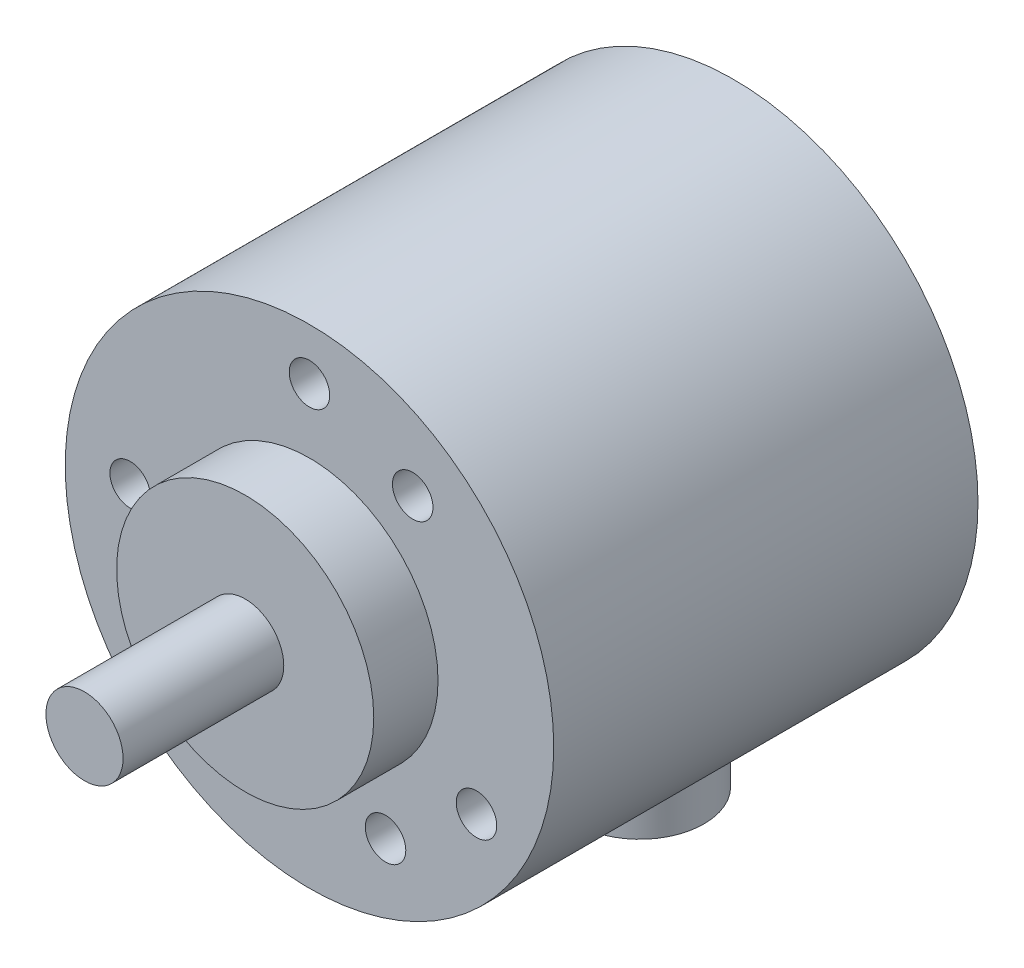
ISO-10303-21;
HEADER;
FILE_DESCRIPTION(('STEP AP214'),'2;1');
FILE_NAME('part.step','',(''),(''),'','','');
FILE_SCHEMA(('AUTOMOTIVE_DESIGN { 1 0 10303 214 1 1 1 1 }'));
ENDSEC;
DATA;
#1=APPLICATION_CONTEXT('core data for automotive mechanical design processes');
#2=APPLICATION_PROTOCOL_DEFINITION('international standard','automotive_design',2000,#1);
#3=PRODUCT_CONTEXT('',#1,'mechanical');
#4=PRODUCT('Part','Part','',(#3));
#5=PRODUCT_RELATED_PRODUCT_CATEGORY('part','',(#4));
#6=PRODUCT_DEFINITION_FORMATION('','',#4);
#7=PRODUCT_DEFINITION_CONTEXT('part definition',#1,'design');
#8=PRODUCT_DEFINITION('design','',#6,#7);
#9=PRODUCT_DEFINITION_SHAPE('','',#8);
#10=(LENGTH_UNIT() NAMED_UNIT(*) SI_UNIT(.MILLI.,.METRE.));
#11=(NAMED_UNIT(*) PLANE_ANGLE_UNIT() SI_UNIT($,.RADIAN.));
#12=(NAMED_UNIT(*) SI_UNIT($,.STERADIAN.) SOLID_ANGLE_UNIT());
#13=UNCERTAINTY_MEASURE_WITH_UNIT(LENGTH_MEASURE(1.E-05),#10,'distance_accuracy_value','');
#14=(GEOMETRIC_REPRESENTATION_CONTEXT(3) GLOBAL_UNCERTAINTY_ASSIGNED_CONTEXT((#13)) GLOBAL_UNIT_ASSIGNED_CONTEXT((#10,
#11,#12)) REPRESENTATION_CONTEXT('',''));
#15=CARTESIAN_POINT('',(0.,0.,0.));
#16=DIRECTION('',(0.,0.,1.));
#17=DIRECTION('',(1.,0.,0.));
#18=AXIS2_PLACEMENT_3D('',#15,#16,#17);
#19=CARTESIAN_POINT('',(0.,0.,-33.));
#20=DIRECTION('',(0.,0.,1.));
#21=DIRECTION('',(1.,0.,0.));
#22=AXIS2_PLACEMENT_3D('',#19,#20,#21);
#23=CYLINDRICAL_SURFACE('',#22,19.);
#24=CARTESIAN_POINT('',(0.,-19.,-20.6885576271931));
#25=CARTESIAN_POINT('',(-0.275769326400333,-18.9999957178638,-20.6885644438757));
#26=CARTESIAN_POINT('',(-0.551612339964107,-18.9939369110743,-20.7114487901662));
#27=CARTESIAN_POINT('',(-1.09536084420814,-18.9703552522905,-20.8022249046444));
#28=CARTESIAN_POINT('',(-1.36326229934773,-18.9528266728315,-20.8701391588736));
#29=CARTESIAN_POINT('',(-1.88319959043665,-18.9082415265209,-21.0486207779896));
#30=CARTESIAN_POINT('',(-2.13525511097029,-18.8811970679014,-21.1591339559744));
#31=CARTESIAN_POINT('',(-2.61725305763118,-18.8204430306565,-21.4194776693207));
#32=CARTESIAN_POINT('',(-2.84719416312159,-18.7867330543442,-21.5693105508009));
#33=CARTESIAN_POINT('',(-3.28363987258849,-18.7154388327318,-21.9076208585884));
#34=CARTESIAN_POINT('',(-3.48957269264305,-18.6777897345587,-22.0968222823242));
#35=CARTESIAN_POINT('',(-3.86718169173115,-18.6032800591516,-22.5069507445252));
#36=CARTESIAN_POINT('',(-4.03885358169212,-18.5664195811586,-22.7278817492216));
#37=CARTESIAN_POINT('',(-4.34583417024358,-18.4969993222001,-23.199735163946));
#38=CARTESIAN_POINT('',(-4.48048899736331,-18.4645214758363,-23.4510961317811));
#39=CARTESIAN_POINT('',(-4.7054029505289,-18.4084956128093,-23.9738818356396));
#40=CARTESIAN_POINT('',(-4.79567002552072,-18.3849459974541,-24.2453029692724));
#41=CARTESIAN_POINT('',(-4.92726790269511,-18.3501118941767,-24.7941814834072));
#42=CARTESIAN_POINT('',(-4.96963355234476,-18.3385684873096,-25.0713739228889));
#43=CARTESIAN_POINT('',(-5.00745164847048,-18.328279903082,-25.6291536385349));
#44=CARTESIAN_POINT('',(-5.00291261345676,-18.3295324018157,-25.9097402890204));
#45=CARTESIAN_POINT('',(-4.9478726318895,-18.3444621543897,-26.4582980861095));
#46=CARTESIAN_POINT('',(-4.89861973809088,-18.3578020069334,-26.7264050947366));
#47=CARTESIAN_POINT('',(-4.75754734011486,-18.3948637106681,-27.2504096346106));
#48=CARTESIAN_POINT('',(-4.66572451326531,-18.4185863722508,-27.5063062110879));
#49=CARTESIAN_POINT('',(-4.4410917967273,-18.4740402179201,-28.0018992013427));
#50=CARTESIAN_POINT('',(-4.30784106339798,-18.5058568359772,-28.2413858353188));
#51=CARTESIAN_POINT('',(-4.00444274039802,-18.573867245553,-28.6950403454886));
#52=CARTESIAN_POINT('',(-3.83428805975344,-18.6100618777007,-28.9092033435905));
#53=CARTESIAN_POINT('',(-3.45551254292273,-18.6841580271555,-29.3132666121022));
#54=CARTESIAN_POINT('',(-3.24584253203104,-18.7220772644082,-29.5021814711523));
#55=CARTESIAN_POINT('',(-2.79733618090121,-18.794319031737,-29.8423669359891));
#56=CARTESIAN_POINT('',(-2.55849875038486,-18.828641427274,-29.9936361339384));
#57=CARTESIAN_POINT('',(-2.05693717567475,-18.8900243975419,-30.2546544871163));
#58=CARTESIAN_POINT('',(-1.79411828743571,-18.9170543384444,-30.364229260866));
#59=CARTESIAN_POINT('',(-1.25291705070341,-18.9605851829004,-30.5373584547851));
#60=CARTESIAN_POINT('',(-0.974538024889809,-18.9770883250536,-30.600922659821));
#61=CARTESIAN_POINT('',(-0.418531665055095,-18.9973691359723,-30.6786882684621));
#62=CARTESIAN_POINT('',(-0.141104095967862,-19.0014922111205,-30.6942298811987));
#63=CARTESIAN_POINT('',(0.412392174634826,-18.9975393920985,-30.6792048349418));
#64=CARTESIAN_POINT('',(0.688461009865304,-18.9894647234237,-30.648642807936));
#65=CARTESIAN_POINT('',(1.22664703082866,-18.9622464275131,-30.5433785359608));
#66=CARTESIAN_POINT('',(1.48892004105413,-18.9432894848034,-30.4694202871233));
#67=CARTESIAN_POINT('',(1.99731390900085,-18.8964538133382,-30.2803238861059));
#68=CARTESIAN_POINT('',(2.24343303697948,-18.8685741310162,-30.1651813324353));
#69=CARTESIAN_POINT('',(2.71776721238243,-18.8061722513547,-29.8944749829268));
#70=CARTESIAN_POINT('',(2.94554769813589,-18.7715327802268,-29.738177448049));
#71=CARTESIAN_POINT('',(3.37211945160329,-18.6996172131604,-29.3905235664122));
#72=CARTESIAN_POINT('',(3.57090513544079,-18.6623406114053,-29.1991604826284));
#73=CARTESIAN_POINT('',(3.93946537763554,-18.5880870950829,-28.7805596057893));
#74=CARTESIAN_POINT('',(4.10829545608396,-18.5511463973769,-28.5524823005092));
#75=CARTESIAN_POINT('',(4.40530154568804,-18.4828739909468,-28.0704566349354));
#76=CARTESIAN_POINT('',(4.5334792853183,-18.451542043772,-27.8165093751988));
#77=CARTESIAN_POINT('',(4.74457728048383,-18.3983923637822,-27.2912451580635));
#78=CARTESIAN_POINT('',(4.82776168851186,-18.3765192543105,-27.0200402648783));
#79=CARTESIAN_POINT('',(4.94715371079317,-18.3447420107922,-26.4668211727028));
#80=CARTESIAN_POINT('',(4.98337294925862,-18.3348349151139,-26.1848096662236));
#81=CARTESIAN_POINT('',(5.00715081173977,-18.3283542048942,-25.6276392717423));
#82=CARTESIAN_POINT('',(4.99622557405378,-18.3313651360785,-25.3525489364774));
#83=CARTESIAN_POINT('',(4.92953140114559,-18.3494111434725,-24.8082816187589));
#84=CARTESIAN_POINT('',(4.87376356323929,-18.3644459254538,-24.5391044917723));
#85=CARTESIAN_POINT('',(4.71983552306685,-18.404601627765,-24.0161567242314));
#86=CARTESIAN_POINT('',(4.6219886449165,-18.4296479062774,-23.7622877250283));
#87=CARTESIAN_POINT('',(4.38692411825137,-18.487008102539,-23.2743792997176));
#88=CARTESIAN_POINT('',(4.24970044321719,-18.5193231325885,-23.0403429160491));
#89=CARTESIAN_POINT('',(3.93514861806089,-18.5887388284062,-22.5914868020298));
#90=CARTESIAN_POINT('',(3.75678207589861,-18.6259502628499,-22.377411792047));
#91=CARTESIAN_POINT('',(3.36699304774797,-18.7003384349729,-21.9817388004712));
#92=CARTESIAN_POINT('',(3.15556257964815,-18.7375151620875,-21.8001486839575));
#93=CARTESIAN_POINT('',(2.70037417260271,-18.8085635163672,-21.4709171344818));
#94=CARTESIAN_POINT('',(2.45603841361695,-18.8423509547618,-21.3240549077127));
#95=CARTESIAN_POINT('',(1.94526775833223,-18.9019003201304,-21.0737227260058));
#96=CARTESIAN_POINT('',(1.67884754204237,-18.9276675250045,-20.9702242189807));
#97=CARTESIAN_POINT('',(1.1777515930537,-18.9648374183622,-20.8234614468889));
#98=CARTESIAN_POINT('',(0.945286703979938,-18.9779285000888,-20.7729882261237));
#99=CARTESIAN_POINT('',(0.475232463380953,-18.9955112347954,-20.7055349416406));
#100=CARTESIAN_POINT('',(0.237643592071627,-19.0000036901211,-20.6885517529324));
#101=CARTESIAN_POINT('',(0.,-19.,-20.6885576271931));
#102=B_SPLINE_CURVE_WITH_KNOTS('',3,(#24,#25,#26,#27,#28,#29,#30,#31,#32,#33,#34,#35,#36,#37,
#38,#39,#40,#41,#42,#43,#44,#45,#46,#47,#48,#49,#50,#51,#52,#53,#54,#55,#56,#57,#58,#59,#60,#61,
#62,#63,#64,#65,#66,#67,#68,#69,#70,#71,#72,#73,#74,#75,#76,#77,#78,#79,#80,#81,#82,#83,#84,#85,
#86,#87,#88,#89,#90,#91,#92,#93,#94,#95,#96,#97,#98,#99,#100,#101),.UNSPECIFIED.,.T.,.F.,(4,2,2,
2,2,2,2,2,2,2,2,2,2,2,2,2,2,2,2,2,2,2,2,2,2,2,2,2,2,2,2,2,2,2,2,2,2,2,4),(0.,0.826436614585058,
1.65328622796854,2.47908752031453,3.30493809758612,4.14758534874994,4.99033802353204,
5.84713921235247,6.70378690953223,7.54155141820608,8.37916378045474,9.19409222959364,
10.0090842963108,10.8330642107706,11.6572025907903,12.5074895148544,13.35780823238,
14.2116451980492,15.0653005285529,15.8949065177972,16.7244291628853,17.5401294360794,
18.3559169116766,19.187369712665,20.0189824256652,20.873388302508,21.7277578464623,
22.577055451357,23.4261428089294,24.2481310576987,25.0700991927074,25.8860500675688,
26.702125888318,27.5416338064332,28.3813447077047,29.2384104629446,30.0949110079133,
30.8071573512508,31.5193372309826),.UNSPECIFIED.);
#103=CARTESIAN_POINT('',(0.,-19.,-20.6885576271931));
#104=VERTEX_POINT('',#103);
#105=EDGE_CURVE('E10',#104,#104,#102,.T.);
#106=ORIENTED_EDGE('',*,*,#105,.F.);
#107=EDGE_LOOP('',(#106));
#108=FACE_BOUND('',#107,.T.);
#109=CARTESIAN_POINT('',(0.,0.,-33.));
#110=DIRECTION('',(0.,0.,1.));
#111=DIRECTION('',(1.,0.,0.));
#112=AXIS2_PLACEMENT_3D('',#109,#110,#111);
#113=CIRCLE('',#112,19.);
#114=CARTESIAN_POINT('',(19.,0.,-33.));
#115=VERTEX_POINT('',#114);
#116=EDGE_CURVE('E50',#115,#115,#113,.T.);
#117=ORIENTED_EDGE('',*,*,#116,.T.);
#118=EDGE_LOOP('',(#117));
#119=FACE_BOUND('',#118,.T.);
#120=CARTESIAN_POINT('',(0.,0.,0.));
#121=DIRECTION('',(0.,0.,1.));
#122=DIRECTION('',(1.,0.,0.));
#123=AXIS2_PLACEMENT_3D('',#120,#121,#122);
#124=CIRCLE('',#123,19.);
#125=CARTESIAN_POINT('',(19.,0.,0.));
#126=VERTEX_POINT('',#125);
#127=EDGE_CURVE('E57',#126,#126,#124,.T.);
#128=ORIENTED_EDGE('',*,*,#127,.F.);
#129=EDGE_LOOP('',(#128));
#130=FACE_BOUND('',#129,.T.);
#131=ADVANCED_FACE('F38',(#108,#119,#130),#23,.T.);
#132=CARTESIAN_POINT('',(0.,0.,-33.));
#133=DIRECTION('',(0.,0.,1.));
#134=DIRECTION('',(1.,0.,0.));
#135=AXIS2_PLACEMENT_3D('',#132,#133,#134);
#136=PLANE('',#135);
#137=ORIENTED_EDGE('',*,*,#116,.F.);
#138=EDGE_LOOP('',(#137));
#139=FACE_BOUND('',#138,.T.);
#140=ADVANCED_FACE('F144',(#139),#136,.F.);
#141=CARTESIAN_POINT('',(0.,0.,0.));
#142=DIRECTION('',(0.,0.,1.));
#143=DIRECTION('',(1.,0.,0.));
#144=AXIS2_PLACEMENT_3D('',#141,#142,#143);
#145=PLANE('',#144);
#146=CARTESIAN_POINT('',(0.,15.,0.));
#147=DIRECTION('',(0.,0.,1.));
#148=DIRECTION('',(1.,0.,0.));
#149=AXIS2_PLACEMENT_3D('',#146,#147,#148);
#150=CIRCLE('',#149,1.575);
#151=CARTESIAN_POINT('',(1.575,15.,0.));
#152=VERTEX_POINT('',#151);
#153=EDGE_CURVE('E101',#152,#152,#150,.T.);
#154=ORIENTED_EDGE('',*,*,#153,.F.);
#155=EDGE_LOOP('',(#154));
#156=FACE_BOUND('',#155,.T.);
#157=CARTESIAN_POINT('',(-13.946725773284,1.22018039846628,0.));
#158=DIRECTION('',(0.,0.,1.));
#159=DIRECTION('',(1.,0.,0.));
#160=AXIS2_PLACEMENT_3D('',#157,#158,#159);
#161=CIRCLE('',#160,1.57500000000105);
#162=CARTESIAN_POINT('',(-12.3717257732829,1.22018039846628,0.));
#163=VERTEX_POINT('',#162);
#164=EDGE_CURVE('E107',#163,#163,#161,.T.);
#165=ORIENTED_EDGE('',*,*,#164,.F.);
#166=EDGE_LOOP('',(#165));
#167=FACE_BOUND('',#166,.T.);
#168=CARTESIAN_POINT('',(12.9903810567675,-7.49999999999945,0.));
#169=DIRECTION('',(0.,0.,1.));
#170=DIRECTION('',(1.,0.,0.));
#171=AXIS2_PLACEMENT_3D('',#168,#169,#170);
#172=CIRCLE('',#171,1.575);
#173=CARTESIAN_POINT('',(14.5653810567675,-7.49999999999945,0.));
#174=VERTEX_POINT('',#173);
#175=EDGE_CURVE('E98',#174,#174,#172,.T.);
#176=ORIENTED_EDGE('',*,*,#175,.F.);
#177=EDGE_LOOP('',(#176));
#178=FACE_BOUND('',#177,.T.);
#179=CARTESIAN_POINT('',(-12.9903810567656,-7.50000000000056,0.));
#180=DIRECTION('',(0.,0.,1.));
#181=DIRECTION('',(1.,0.,0.));
#182=AXIS2_PLACEMENT_3D('',#179,#180,#181);
#183=CIRCLE('',#182,1.575);
#184=CARTESIAN_POINT('',(-11.4153810567656,-7.50000000000056,0.));
#185=VERTEX_POINT('',#184);
#186=EDGE_CURVE('E89',#185,#185,#183,.T.);
#187=ORIENTED_EDGE('',*,*,#186,.F.);
#188=EDGE_LOOP('',(#187));
#189=FACE_BOUND('',#188,.T.);
#190=CARTESIAN_POINT('',(8.03007010891466,11.4681286200459,0.));
#191=DIRECTION('',(0.,0.,1.));
#192=DIRECTION('',(1.,0.,0.));
#193=AXIS2_PLACEMENT_3D('',#190,#191,#192);
#194=CIRCLE('',#193,1.575);
#195=CARTESIAN_POINT('',(9.60507010891466,11.4681286200459,0.));
#196=VERTEX_POINT('',#195);
#197=EDGE_CURVE('E90',#196,#196,#194,.T.);
#198=ORIENTED_EDGE('',*,*,#197,.F.);
#199=EDGE_LOOP('',(#198));
#200=FACE_BOUND('',#199,.T.);
#201=CARTESIAN_POINT('',(5.91665566437082,-12.6883090185132,0.));
#202=DIRECTION('',(0.,0.,1.));
#203=DIRECTION('',(1.,0.,0.));
#204=AXIS2_PLACEMENT_3D('',#201,#202,#203);
#205=CIRCLE('',#204,1.57500000000018);
#206=CARTESIAN_POINT('',(7.491655664371,-12.6883090185132,0.));
#207=VERTEX_POINT('',#206);
#208=EDGE_CURVE('E106',#207,#207,#205,.T.);
#209=ORIENTED_EDGE('',*,*,#208,.F.);
#210=EDGE_LOOP('',(#209));
#211=FACE_BOUND('',#210,.T.);
#212=CARTESIAN_POINT('',(0.,0.,0.));
#213=DIRECTION('',(0.,0.,1.));
#214=DIRECTION('',(1.,0.,0.));
#215=AXIS2_PLACEMENT_3D('',#212,#213,#214);
#216=CIRCLE('',#215,10.);
#217=CARTESIAN_POINT('',(10.,0.,0.));
#218=VERTEX_POINT('',#217);
#219=EDGE_CURVE('E66',#218,#218,#216,.T.);
#220=ORIENTED_EDGE('',*,*,#219,.F.);
#221=EDGE_LOOP('',(#220));
#222=FACE_BOUND('',#221,.T.);
#223=ORIENTED_EDGE('',*,*,#127,.T.);
#224=EDGE_LOOP('',(#223));
#225=FACE_BOUND('',#224,.T.);
#226=ADVANCED_FACE('F140',(#156,#167,#178,#189,#200,#211,#222,#225),#145,.T.);
#227=CARTESIAN_POINT('',(0.,0.,5.));
#228=DIRECTION('',(0.,0.,-1.));
#229=DIRECTION('',(-1.,0.,0.));
#230=AXIS2_PLACEMENT_3D('',#227,#228,#229);
#231=CYLINDRICAL_SURFACE('',#230,10.);
#232=CARTESIAN_POINT('',(0.,0.,5.));
#233=DIRECTION('',(0.,0.,1.));
#234=DIRECTION('',(1.,0.,0.));
#235=AXIS2_PLACEMENT_3D('',#232,#233,#234);
#236=CIRCLE('',#235,10.);
#237=CARTESIAN_POINT('',(10.,0.,5.));
#238=VERTEX_POINT('',#237);
#239=EDGE_CURVE('E64',#238,#238,#236,.T.);
#240=ORIENTED_EDGE('',*,*,#239,.F.);
#241=EDGE_LOOP('',(#240));
#242=FACE_BOUND('',#241,.T.);
#243=ORIENTED_EDGE('',*,*,#219,.T.);
#244=EDGE_LOOP('',(#243));
#245=FACE_BOUND('',#244,.T.);
#246=ADVANCED_FACE('F143',(#242,#245),#231,.T.);
#247=CARTESIAN_POINT('',(0.,0.,5.));
#248=DIRECTION('',(0.,0.,1.));
#249=DIRECTION('',(1.,0.,0.));
#250=AXIS2_PLACEMENT_3D('',#247,#248,#249);
#251=PLANE('',#250);
#252=CARTESIAN_POINT('',(0.,0.,5.));
#253=DIRECTION('',(0.,0.,1.));
#254=DIRECTION('',(1.,0.,0.));
#255=AXIS2_PLACEMENT_3D('',#252,#253,#254);
#256=CIRCLE('',#255,3.);
#257=CARTESIAN_POINT('',(3.,0.,5.));
#258=VERTEX_POINT('',#257);
#259=EDGE_CURVE('E70',#258,#258,#256,.T.);
#260=ORIENTED_EDGE('',*,*,#259,.F.);
#261=EDGE_LOOP('',(#260));
#262=FACE_BOUND('',#261,.T.);
#263=ORIENTED_EDGE('',*,*,#239,.T.);
#264=EDGE_LOOP('',(#263));
#265=FACE_BOUND('',#264,.T.);
#266=ADVANCED_FACE('F170',(#262,#265),#251,.T.);
#267=CARTESIAN_POINT('',(0.,0.,17.5));
#268=DIRECTION('',(0.,0.,-1.));
#269=DIRECTION('',(-1.,0.,0.));
#270=AXIS2_PLACEMENT_3D('',#267,#268,#269);
#271=CYLINDRICAL_SURFACE('',#270,3.);
#272=ORIENTED_EDGE('',*,*,#259,.T.);
#273=EDGE_LOOP('',(#272));
#274=FACE_BOUND('',#273,.T.);
#275=CARTESIAN_POINT('',(0.,0.,17.5));
#276=DIRECTION('',(0.,0.,1.));
#277=DIRECTION('',(1.,0.,0.));
#278=AXIS2_PLACEMENT_3D('',#275,#276,#277);
#279=CIRCLE('',#278,3.);
#280=CARTESIAN_POINT('',(3.,0.,17.5));
#281=VERTEX_POINT('',#280);
#282=EDGE_CURVE('E71',#281,#281,#279,.T.);
#283=ORIENTED_EDGE('',*,*,#282,.F.);
#284=EDGE_LOOP('',(#283));
#285=FACE_BOUND('',#284,.T.);
#286=ADVANCED_FACE('F174',(#274,#285),#271,.T.);
#287=CARTESIAN_POINT('',(0.,0.,17.5));
#288=DIRECTION('',(0.,0.,1.));
#289=DIRECTION('',(1.,0.,0.));
#290=AXIS2_PLACEMENT_3D('',#287,#288,#289);
#291=PLANE('',#290);
#292=ORIENTED_EDGE('',*,*,#282,.T.);
#293=EDGE_LOOP('',(#292));
#294=FACE_BOUND('',#293,.T.);
#295=ADVANCED_FACE('F178',(#294),#291,.T.);
#296=CARTESIAN_POINT('',(0.,-25.,-25.6885576271931));
#297=DIRECTION('',(0.,1.,0.));
#298=DIRECTION('',(0.,0.,1.));
#299=AXIS2_PLACEMENT_3D('',#296,#297,#298);
#300=CYLINDRICAL_SURFACE('',#299,5.);
#301=ORIENTED_EDGE('',*,*,#105,.T.);
#302=EDGE_LOOP('',(#301));
#303=FACE_BOUND('',#302,.T.);
#304=CARTESIAN_POINT('',(0.,-25.,-25.6885576271931));
#305=DIRECTION('',(0.,1.,0.));
#306=DIRECTION('',(0.,0.,1.));
#307=AXIS2_PLACEMENT_3D('',#304,#305,#306);
#308=CIRCLE('',#307,5.);
#309=CARTESIAN_POINT('',(0.,-25.,-20.6885576271931));
#310=VERTEX_POINT('',#309);
#311=EDGE_CURVE('E81',#310,#310,#308,.T.);
#312=ORIENTED_EDGE('',*,*,#311,.T.);
#313=EDGE_LOOP('',(#312));
#314=FACE_BOUND('',#313,.T.);
#315=ADVANCED_FACE('F180',(#303,#314),#300,.T.);
#316=CARTESIAN_POINT('',(0.,-25.,-25.6885576271931));
#317=DIRECTION('',(0.,1.,0.));
#318=DIRECTION('',(0.,0.,1.));
#319=AXIS2_PLACEMENT_3D('',#316,#317,#318);
#320=PLANE('',#319);
#321=ORIENTED_EDGE('',*,*,#311,.F.);
#322=EDGE_LOOP('',(#321));
#323=FACE_BOUND('',#322,.T.);
#324=ADVANCED_FACE('F185',(#323),#320,.F.);
#325=CARTESIAN_POINT('',(5.91665566437082,-12.6883090185132,-6.));
#326=DIRECTION('',(0.,0.,1.));
#327=DIRECTION('',(1.,0.,0.));
#328=AXIS2_PLACEMENT_3D('',#325,#326,#327);
#329=CYLINDRICAL_SURFACE('',#328,1.57500000000018);
#330=CARTESIAN_POINT('',(5.91665566437082,-12.6883090185132,-6.));
#331=DIRECTION('',(0.,0.,1.));
#332=DIRECTION('',(1.,0.,0.));
#333=AXIS2_PLACEMENT_3D('',#330,#331,#332);
#334=CIRCLE('',#333,1.57500000000018);
#335=CARTESIAN_POINT('',(7.491655664371,-12.6883090185132,-6.));
#336=VERTEX_POINT('',#335);
#337=EDGE_CURVE('E102',#336,#336,#334,.T.);
#338=ORIENTED_EDGE('',*,*,#337,.F.);
#339=EDGE_LOOP('',(#338));
#340=FACE_BOUND('',#339,.T.);
#341=ORIENTED_EDGE('',*,*,#208,.T.);
#342=EDGE_LOOP('',(#341));
#343=FACE_BOUND('',#342,.T.);
#344=ADVANCED_FACE('F188',(#340,#343),#329,.F.);
#345=CARTESIAN_POINT('',(5.91665566437082,-12.6883090185132,-6.));
#346=DIRECTION('',(0.,0.,1.));
#347=DIRECTION('',(1.,0.,0.));
#348=AXIS2_PLACEMENT_3D('',#345,#346,#347);
#349=PLANE('',#348);
#350=ORIENTED_EDGE('',*,*,#337,.T.);
#351=EDGE_LOOP('',(#350));
#352=FACE_BOUND('',#351,.T.);
#353=ADVANCED_FACE('F208',(#352),#349,.T.);
#354=CARTESIAN_POINT('',(8.03007010891466,11.4681286200459,-6.));
#355=DIRECTION('',(0.,0.,1.));
#356=DIRECTION('',(1.,0.,0.));
#357=AXIS2_PLACEMENT_3D('',#354,#355,#356);
#358=CYLINDRICAL_SURFACE('',#357,1.575);
#359=CARTESIAN_POINT('',(8.03007010891466,11.4681286200459,-6.));
#360=DIRECTION('',(0.,0.,1.));
#361=DIRECTION('',(1.,0.,0.));
#362=AXIS2_PLACEMENT_3D('',#359,#360,#361);
#363=CIRCLE('',#362,1.575);
#364=CARTESIAN_POINT('',(9.60507010891466,11.4681286200459,-6.));
#365=VERTEX_POINT('',#364);
#366=EDGE_CURVE('E111',#365,#365,#363,.T.);
#367=ORIENTED_EDGE('',*,*,#366,.F.);
#368=EDGE_LOOP('',(#367));
#369=FACE_BOUND('',#368,.T.);
#370=ORIENTED_EDGE('',*,*,#197,.T.);
#371=EDGE_LOOP('',(#370));
#372=FACE_BOUND('',#371,.T.);
#373=ADVANCED_FACE('F211',(#369,#372),#358,.F.);
#374=CARTESIAN_POINT('',(8.03007010891466,11.4681286200459,-6.));
#375=DIRECTION('',(0.,0.,1.));
#376=DIRECTION('',(1.,0.,0.));
#377=AXIS2_PLACEMENT_3D('',#374,#375,#376);
#378=PLANE('',#377);
#379=ORIENTED_EDGE('',*,*,#366,.T.);
#380=EDGE_LOOP('',(#379));
#381=FACE_BOUND('',#380,.T.);
#382=ADVANCED_FACE('F198',(#381),#378,.T.);
#383=CARTESIAN_POINT('',(-12.9903810567656,-7.50000000000056,-6.));
#384=DIRECTION('',(0.,0.,1.));
#385=DIRECTION('',(1.,0.,0.));
#386=AXIS2_PLACEMENT_3D('',#383,#384,#385);
#387=CYLINDRICAL_SURFACE('',#386,1.575);
#388=CARTESIAN_POINT('',(-12.9903810567656,-7.50000000000056,-6.));
#389=DIRECTION('',(0.,0.,1.));
#390=DIRECTION('',(1.,0.,0.));
#391=AXIS2_PLACEMENT_3D('',#388,#389,#390);
#392=CIRCLE('',#391,1.575);
#393=CARTESIAN_POINT('',(-11.4153810567656,-7.50000000000056,-6.));
#394=VERTEX_POINT('',#393);
#395=EDGE_CURVE('E85',#394,#394,#392,.T.);
#396=ORIENTED_EDGE('',*,*,#395,.F.);
#397=EDGE_LOOP('',(#396));
#398=FACE_BOUND('',#397,.T.);
#399=ORIENTED_EDGE('',*,*,#186,.T.);
#400=EDGE_LOOP('',(#399));
#401=FACE_BOUND('',#400,.T.);
#402=ADVANCED_FACE('F194',(#398,#401),#387,.F.);
#403=CARTESIAN_POINT('',(-12.9903810567656,-7.50000000000056,-6.));
#404=DIRECTION('',(0.,0.,1.));
#405=DIRECTION('',(1.,0.,0.));
#406=AXIS2_PLACEMENT_3D('',#403,#404,#405);
#407=PLANE('',#406);
#408=ORIENTED_EDGE('',*,*,#395,.T.);
#409=EDGE_LOOP('',(#408));
#410=FACE_BOUND('',#409,.T.);
#411=ADVANCED_FACE('F190',(#410),#407,.T.);
#412=CARTESIAN_POINT('',(12.9903810567675,-7.49999999999945,-6.));
#413=DIRECTION('',(0.,0.,1.));
#414=DIRECTION('',(1.,0.,0.));
#415=AXIS2_PLACEMENT_3D('',#412,#413,#414);
#416=CYLINDRICAL_SURFACE('',#415,1.575);
#417=CARTESIAN_POINT('',(12.9903810567675,-7.49999999999945,-6.));
#418=DIRECTION('',(0.,0.,1.));
#419=DIRECTION('',(1.,0.,0.));
#420=AXIS2_PLACEMENT_3D('',#417,#418,#419);
#421=CIRCLE('',#420,1.575);
#422=CARTESIAN_POINT('',(14.5653810567675,-7.49999999999945,-6.));
#423=VERTEX_POINT('',#422);
#424=EDGE_CURVE('E94',#423,#423,#421,.T.);
#425=ORIENTED_EDGE('',*,*,#424,.F.);
#426=EDGE_LOOP('',(#425));
#427=FACE_BOUND('',#426,.T.);
#428=ORIENTED_EDGE('',*,*,#175,.T.);
#429=EDGE_LOOP('',(#428));
#430=FACE_BOUND('',#429,.T.);
#431=ADVANCED_FACE('F193',(#427,#430),#416,.F.);
#432=CARTESIAN_POINT('',(12.9903810567675,-7.49999999999945,-6.));
#433=DIRECTION('',(0.,0.,1.));
#434=DIRECTION('',(1.,0.,0.));
#435=AXIS2_PLACEMENT_3D('',#432,#433,#434);
#436=PLANE('',#435);
#437=ORIENTED_EDGE('',*,*,#424,.T.);
#438=EDGE_LOOP('',(#437));
#439=FACE_BOUND('',#438,.T.);
#440=ADVANCED_FACE('F200',(#439),#436,.T.);
#441=CARTESIAN_POINT('',(-13.946725773284,1.22018039846628,-6.));
#442=DIRECTION('',(0.,0.,1.));
#443=DIRECTION('',(1.,0.,0.));
#444=AXIS2_PLACEMENT_3D('',#441,#442,#443);
#445=CYLINDRICAL_SURFACE('',#444,1.57500000000105);
#446=CARTESIAN_POINT('',(-13.946725773284,1.22018039846628,-6.));
#447=DIRECTION('',(0.,0.,1.));
#448=DIRECTION('',(1.,0.,0.));
#449=AXIS2_PLACEMENT_3D('',#446,#447,#448);
#450=CIRCLE('',#449,1.57500000000105);
#451=CARTESIAN_POINT('',(-12.3717257732829,1.22018039846628,-6.));
#452=VERTEX_POINT('',#451);
#453=EDGE_CURVE('E117',#452,#452,#450,.T.);
#454=ORIENTED_EDGE('',*,*,#453,.F.);
#455=EDGE_LOOP('',(#454));
#456=FACE_BOUND('',#455,.T.);
#457=ORIENTED_EDGE('',*,*,#164,.T.);
#458=EDGE_LOOP('',(#457));
#459=FACE_BOUND('',#458,.T.);
#460=ADVANCED_FACE('F203',(#456,#459),#445,.F.);
#461=CARTESIAN_POINT('',(-13.946725773284,1.22018039846628,-6.));
#462=DIRECTION('',(0.,0.,1.));
#463=DIRECTION('',(1.,0.,0.));
#464=AXIS2_PLACEMENT_3D('',#461,#462,#463);
#465=PLANE('',#464);
#466=ORIENTED_EDGE('',*,*,#453,.T.);
#467=EDGE_LOOP('',(#466));
#468=FACE_BOUND('',#467,.T.);
#469=ADVANCED_FACE('F136',(#468),#465,.T.);
#470=CARTESIAN_POINT('',(0.,15.,-6.));
#471=DIRECTION('',(0.,0.,1.));
#472=DIRECTION('',(1.,0.,0.));
#473=AXIS2_PLACEMENT_3D('',#470,#471,#472);
#474=CYLINDRICAL_SURFACE('',#473,1.575);
#475=CARTESIAN_POINT('',(0.,15.,-6.));
#476=DIRECTION('',(0.,0.,1.));
#477=DIRECTION('',(1.,0.,0.));
#478=AXIS2_PLACEMENT_3D('',#475,#476,#477);
#479=CIRCLE('',#478,1.575);
#480=CARTESIAN_POINT('',(1.575,15.,-6.));
#481=VERTEX_POINT('',#480);
#482=EDGE_CURVE('E84',#481,#481,#479,.T.);
#483=ORIENTED_EDGE('',*,*,#482,.F.);
#484=EDGE_LOOP('',(#483));
#485=FACE_BOUND('',#484,.T.);
#486=ORIENTED_EDGE('',*,*,#153,.T.);
#487=EDGE_LOOP('',(#486));
#488=FACE_BOUND('',#487,.T.);
#489=ADVANCED_FACE('F133',(#485,#488),#474,.F.);
#490=CARTESIAN_POINT('',(0.,15.,-6.));
#491=DIRECTION('',(0.,0.,1.));
#492=DIRECTION('',(1.,0.,0.));
#493=AXIS2_PLACEMENT_3D('',#490,#491,#492);
#494=PLANE('',#493);
#495=ORIENTED_EDGE('',*,*,#482,.T.);
#496=EDGE_LOOP('',(#495));
#497=FACE_BOUND('',#496,.T.);
#498=ADVANCED_FACE('F131',(#497),#494,.T.);
#499=CLOSED_SHELL('',(#131,#140,#226,#246,#266,#286,#295,#315,#324,#344,#353,#373,#382,#402,
#411,#431,#440,#460,#469,#489,#498));
#500=MANIFOLD_SOLID_BREP('B2',#499);
#501=ADVANCED_BREP_SHAPE_REPRESENTATION('',(#18,#500),#14);
#502=SHAPE_DEFINITION_REPRESENTATION(#9,#501);
ENDSEC;
END-ISO-10303-21;
